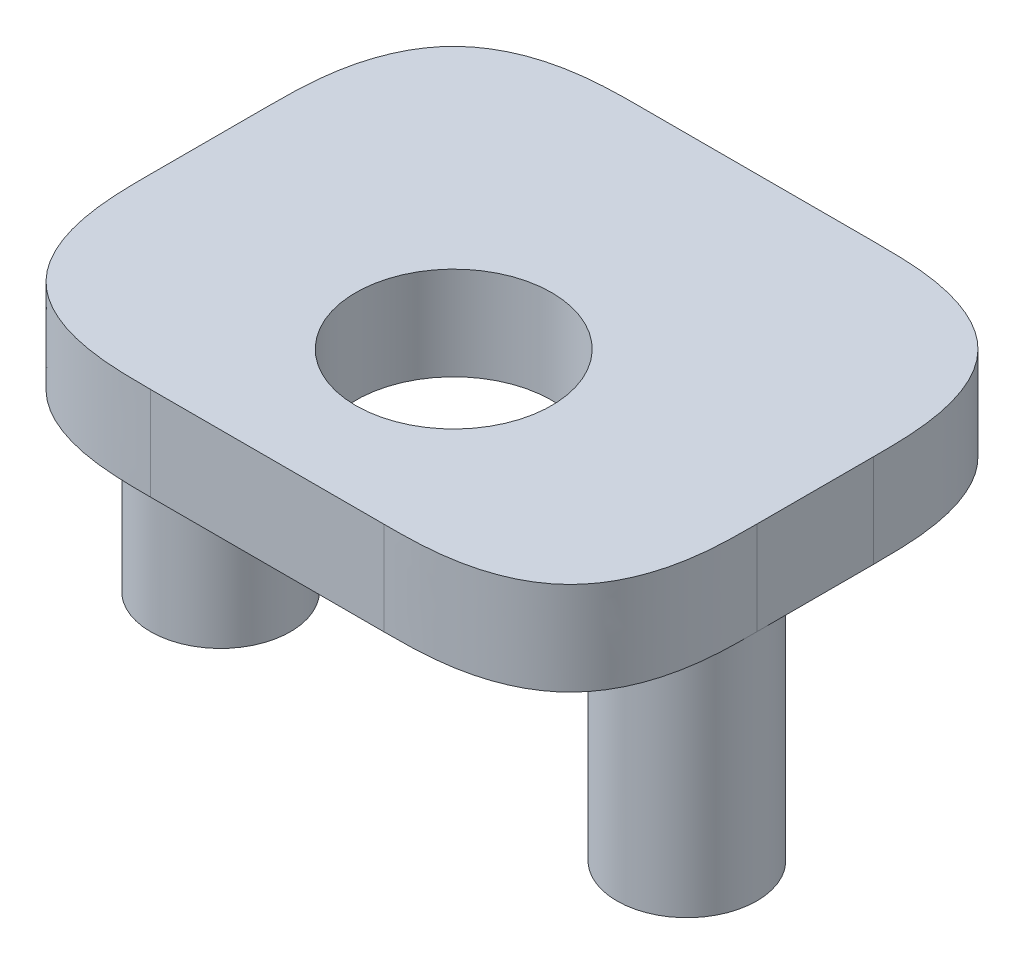
ISO-10303-21;
HEADER;
FILE_DESCRIPTION(('STEP AP214'),'2;1');
FILE_NAME('part.step','',(''),(''),'','','');
FILE_SCHEMA(('AUTOMOTIVE_DESIGN { 1 0 10303 214 1 1 1 1 }'));
ENDSEC;
DATA;
#1=APPLICATION_CONTEXT('core data for automotive mechanical design processes');
#2=APPLICATION_PROTOCOL_DEFINITION('international standard','automotive_design',2000,#1);
#3=PRODUCT_CONTEXT('',#1,'mechanical');
#4=PRODUCT('Part','Part','',(#3));
#5=PRODUCT_RELATED_PRODUCT_CATEGORY('part','',(#4));
#6=PRODUCT_DEFINITION_FORMATION('','',#4);
#7=PRODUCT_DEFINITION_CONTEXT('part definition',#1,'design');
#8=PRODUCT_DEFINITION('design','',#6,#7);
#9=PRODUCT_DEFINITION_SHAPE('','',#8);
#10=(LENGTH_UNIT() NAMED_UNIT(*) SI_UNIT(.MILLI.,.METRE.));
#11=(NAMED_UNIT(*) PLANE_ANGLE_UNIT() SI_UNIT($,.RADIAN.));
#12=(NAMED_UNIT(*) SI_UNIT($,.STERADIAN.) SOLID_ANGLE_UNIT());
#13=UNCERTAINTY_MEASURE_WITH_UNIT(LENGTH_MEASURE(1.E-05),#10,'distance_accuracy_value','');
#14=(GEOMETRIC_REPRESENTATION_CONTEXT(3) GLOBAL_UNCERTAINTY_ASSIGNED_CONTEXT((#13)) GLOBAL_UNIT_ASSIGNED_CONTEXT((#10,
#11,#12)) REPRESENTATION_CONTEXT('',''));
#15=CARTESIAN_POINT('',(0.,0.,0.));
#16=DIRECTION('',(0.,0.,1.));
#17=DIRECTION('',(1.,0.,0.));
#18=AXIS2_PLACEMENT_3D('',#15,#16,#17);
#19=CARTESIAN_POINT('',(0.,0.,0.));
#20=DIRECTION('',(0.,1.,0.));
#21=DIRECTION('',(0.,0.,1.));
#22=AXIS2_PLACEMENT_3D('',#19,#20,#21);
#23=PLANE('',#22);
#24=CARTESIAN_POINT('',(-5.,0.,0.));
#25=DIRECTION('',(0.,1.,0.));
#26=DIRECTION('',(0.,0.,1.));
#27=AXIS2_PLACEMENT_3D('',#24,#25,#26);
#28=CIRCLE('',#27,0.95);
#29=CARTESIAN_POINT('',(-5.,0.,0.949999999999965));
#30=VERTEX_POINT('',#29);
#31=EDGE_CURVE('E671',#30,#30,#28,.T.);
#32=ORIENTED_EDGE('',*,*,#31,.T.);
#33=EDGE_LOOP('',(#32));
#34=FACE_BOUND('',#33,.T.);
#35=CARTESIAN_POINT('',(-5.,0.,0.));
#36=DIRECTION('',(0.,1.,0.));
#37=DIRECTION('',(0.,0.,1.));
#38=AXIS2_PLACEMENT_3D('',#35,#36,#37);
#39=CIRCLE('',#38,1.5);
#40=CARTESIAN_POINT('',(-5.,0.,1.49999999999997));
#41=VERTEX_POINT('',#40);
#42=EDGE_CURVE('E183',#41,#41,#39,.T.);
#43=ORIENTED_EDGE('',*,*,#42,.F.);
#44=EDGE_LOOP('',(#43));
#45=FACE_BOUND('',#44,.T.);
#46=ADVANCED_FACE('F67',(#34,#45),#23,.F.);
#47=CARTESIAN_POINT('',(-5.,5.,0.));
#48=DIRECTION('',(0.,-1.,0.));
#49=DIRECTION('',(0.,0.,-1.));
#50=AXIS2_PLACEMENT_3D('',#47,#48,#49);
#51=CYLINDRICAL_SURFACE('',#50,1.5);
#52=CARTESIAN_POINT('',(-5.,5.,0.));
#53=DIRECTION('',(0.,1.,0.));
#54=DIRECTION('',(0.,0.,1.));
#55=AXIS2_PLACEMENT_3D('',#52,#53,#54);
#56=CIRCLE('',#55,1.5);
#57=CARTESIAN_POINT('',(-6.5,5.,0.));
#58=VERTEX_POINT('',#57);
#59=EDGE_CURVE('E152',#58,#58,#56,.T.);
#60=ORIENTED_EDGE('',*,*,#59,.F.);
#61=EDGE_LOOP('',(#60));
#62=FACE_BOUND('',#61,.T.);
#63=ORIENTED_EDGE('',*,*,#42,.T.);
#64=EDGE_LOOP('',(#63));
#65=FACE_BOUND('',#64,.T.);
#66=ADVANCED_FACE('F180',(#62,#65),#51,.T.);
#67=CARTESIAN_POINT('',(-6.5,7.,4.));
#68=DIRECTION('',(1.,0.,0.));
#69=DIRECTION('',(0.,0.,-1.));
#70=AXIS2_PLACEMENT_3D('',#67,#68,#69);
#71=PLANE('',#70);
#72=DIRECTION('',(0.,0.,1.));
#73=VECTOR('',#72,1.);
#74=CARTESIAN_POINT('',(-6.5,5.,4.));
#75=LINE('',#74,#73);
#76=CARTESIAN_POINT('',(-6.5,5.,-2.5));
#77=VERTEX_POINT('',#76);
#78=EDGE_CURVE('E167',#77,#58,#75,.T.);
#79=ORIENTED_EDGE('',*,*,#78,.T.);
#80=CARTESIAN_POINT('',(-6.5,7.1,0.));
#81=CARTESIAN_POINT('',(-6.5,6.36666666666657,0.));
#82=CARTESIAN_POINT('',(-6.5,5.63333333333333,0.));
#83=CARTESIAN_POINT('',(-6.5,4.9,0.));
#84=B_SPLINE_CURVE_WITH_KNOTS('',3,(#80,#81,#82,#83),.UNSPECIFIED.,.F.,.F.,(4,4),(-0.0001,
0.0021),.UNSPECIFIED.);
#85=CARTESIAN_POINT('',(-6.5,7.,0.));
#86=VERTEX_POINT('',#85);
#87=EDGE_CURVE('E170',#58,#86,#84,.F.);
#88=ORIENTED_EDGE('',*,*,#87,.T.);
#89=DIRECTION('',(0.,0.,1.));
#90=VECTOR('',#89,1.);
#91=CARTESIAN_POINT('',(-6.5,7.,4.));
#92=LINE('',#91,#90);
#93=CARTESIAN_POINT('',(-6.5,7.,-2.5));
#94=VERTEX_POINT('',#93);
#95=EDGE_CURVE('E542',#94,#86,#92,.T.);
#96=ORIENTED_EDGE('',*,*,#95,.F.);
#97=CARTESIAN_POINT('',(-6.5,4.9,-2.5));
#98=CARTESIAN_POINT('',(-6.5,5.63333333333333,-2.5));
#99=CARTESIAN_POINT('',(-6.5,6.36666666666657,-2.5));
#100=CARTESIAN_POINT('',(-6.5,7.1,-2.5));
#101=B_SPLINE_CURVE_WITH_KNOTS('',3,(#97,#98,#99,#100),.UNSPECIFIED.,.F.,.F.,(4,4),
(-9.99999999999998E-05,0.0021),.UNSPECIFIED.);
#102=EDGE_CURVE('E174',#94,#77,#101,.F.);
#103=ORIENTED_EDGE('',*,*,#102,.T.);
#104=EDGE_LOOP('',(#79,#88,#96,#103));
#105=FACE_BOUND('',#104,.T.);
#106=ADVANCED_FACE('F168',(#105),#71,.F.);
#107=CARTESIAN_POINT('',(-6.5,7.,4.));
#108=DIRECTION('',(0.,0.,-1.));
#109=DIRECTION('',(-1.,0.,0.));
#110=AXIS2_PLACEMENT_3D('',#107,#108,#109);
#111=PLANE('',#110);
#112=DIRECTION('',(1.,0.,0.));
#113=VECTOR('',#112,1.);
#114=CARTESIAN_POINT('',(-6.5,5.,4.));
#115=LINE('',#114,#113);
#116=CARTESIAN_POINT('',(-2.5,5.,4.));
#117=VERTEX_POINT('',#116);
#118=CARTESIAN_POINT('',(2.5,5.,4.));
#119=VERTEX_POINT('',#118);
#120=EDGE_CURVE('E155',#117,#119,#115,.T.);
#121=ORIENTED_EDGE('',*,*,#120,.T.);
#122=CARTESIAN_POINT('',(2.5,7.1,4.));
#123=CARTESIAN_POINT('',(2.5,6.36666666666657,4.));
#124=CARTESIAN_POINT('',(2.5,5.63333333333333,4.));
#125=CARTESIAN_POINT('',(2.5,4.9,4.));
#126=B_SPLINE_CURVE_WITH_KNOTS('',3,(#122,#123,#124,#125),.UNSPECIFIED.,.F.,.F.,(4,4),(-0.0001,
0.0021),.UNSPECIFIED.);
#127=CARTESIAN_POINT('',(2.5,7.,4.));
#128=VERTEX_POINT('',#127);
#129=EDGE_CURVE('E373',#119,#128,#126,.F.);
#130=ORIENTED_EDGE('',*,*,#129,.T.);
#131=DIRECTION('',(1.,0.,0.));
#132=VECTOR('',#131,1.);
#133=CARTESIAN_POINT('',(-6.5,7.,4.));
#134=LINE('',#133,#132);
#135=CARTESIAN_POINT('',(-2.5,7.,4.));
#136=VERTEX_POINT('',#135);
#137=EDGE_CURVE('E203',#136,#128,#134,.T.);
#138=ORIENTED_EDGE('',*,*,#137,.F.);
#139=CARTESIAN_POINT('',(-2.5,4.9,4.));
#140=CARTESIAN_POINT('',(-2.5,5.63333333333333,4.));
#141=CARTESIAN_POINT('',(-2.5,6.36666666666657,4.));
#142=CARTESIAN_POINT('',(-2.5,7.1,4.));
#143=B_SPLINE_CURVE_WITH_KNOTS('',3,(#139,#140,#141,#142),.UNSPECIFIED.,.F.,.F.,(4,4),
(-9.99999999999998E-05,0.0021),.UNSPECIFIED.);
#144=EDGE_CURVE('E392',#136,#117,#143,.F.);
#145=ORIENTED_EDGE('',*,*,#144,.T.);
#146=EDGE_LOOP('',(#121,#130,#138,#145));
#147=FACE_BOUND('',#146,.T.);
#148=ADVANCED_FACE('F485',(#147),#111,.F.);
#149=CARTESIAN_POINT('',(6.5,7.,4.));
#150=DIRECTION('',(-1.,0.,0.));
#151=DIRECTION('',(0.,0.,1.));
#152=AXIS2_PLACEMENT_3D('',#149,#150,#151);
#153=PLANE('',#152);
#154=DIRECTION('',(0.,0.,-1.));
#155=VECTOR('',#154,1.);
#156=CARTESIAN_POINT('',(6.5,7.,4.));
#157=LINE('',#156,#155);
#158=CARTESIAN_POINT('',(6.5,7.,0.));
#159=VERTEX_POINT('',#158);
#160=CARTESIAN_POINT('',(6.5,7.,-2.5));
#161=VERTEX_POINT('',#160);
#162=EDGE_CURVE('E191',#159,#161,#157,.T.);
#163=ORIENTED_EDGE('',*,*,#162,.F.);
#164=CARTESIAN_POINT('',(6.5,4.9,0.));
#165=CARTESIAN_POINT('',(6.5,5.63333333333333,0.));
#166=CARTESIAN_POINT('',(6.5,6.36666666666657,0.));
#167=CARTESIAN_POINT('',(6.5,7.1,0.));
#168=B_SPLINE_CURVE_WITH_KNOTS('',3,(#164,#165,#166,#167),.UNSPECIFIED.,.F.,.F.,(4,4),
(-9.99999999999998E-05,0.0021),.UNSPECIFIED.);
#169=CARTESIAN_POINT('',(6.5,5.,0.));
#170=VERTEX_POINT('',#169);
#171=EDGE_CURVE('E257',#159,#170,#168,.F.);
#172=ORIENTED_EDGE('',*,*,#171,.T.);
#173=DIRECTION('',(0.,0.,-1.));
#174=VECTOR('',#173,1.);
#175=CARTESIAN_POINT('',(6.5,5.,4.));
#176=LINE('',#175,#174);
#177=CARTESIAN_POINT('',(6.5,5.,-2.5));
#178=VERTEX_POINT('',#177);
#179=EDGE_CURVE('E242',#170,#178,#176,.T.);
#180=ORIENTED_EDGE('',*,*,#179,.T.);
#181=CARTESIAN_POINT('',(6.5,7.1,-2.5));
#182=CARTESIAN_POINT('',(6.5,6.36666666666657,-2.5));
#183=CARTESIAN_POINT('',(6.5,5.63333333333333,-2.5));
#184=CARTESIAN_POINT('',(6.5,4.9,-2.5));
#185=B_SPLINE_CURVE_WITH_KNOTS('',3,(#181,#182,#183,#184),.UNSPECIFIED.,.F.,.F.,(4,4),(-0.0001,
0.0021),.UNSPECIFIED.);
#186=EDGE_CURVE('E189',#178,#161,#185,.F.);
#187=ORIENTED_EDGE('',*,*,#186,.T.);
#188=EDGE_LOOP('',(#163,#172,#180,#187));
#189=FACE_BOUND('',#188,.T.);
#190=ADVANCED_FACE('F254',(#189),#153,.F.);
#191=CARTESIAN_POINT('',(-6.5,7.,-6.5));
#192=DIRECTION('',(0.,0.,1.));
#193=DIRECTION('',(1.,0.,0.));
#194=AXIS2_PLACEMENT_3D('',#191,#192,#193);
#195=PLANE('',#194);
#196=DIRECTION('',(-1.,0.,0.));
#197=VECTOR('',#196,1.);
#198=CARTESIAN_POINT('',(-6.5,7.,-6.5));
#199=LINE('',#198,#197);
#200=CARTESIAN_POINT('',(2.5,7.,-6.5));
#201=VERTEX_POINT('',#200);
#202=CARTESIAN_POINT('',(-2.5,7.,-6.5));
#203=VERTEX_POINT('',#202);
#204=EDGE_CURVE('E184',#201,#203,#199,.T.);
#205=ORIENTED_EDGE('',*,*,#204,.F.);
#206=CARTESIAN_POINT('',(2.5,4.9,-6.5));
#207=CARTESIAN_POINT('',(2.5,5.63333333333333,-6.5));
#208=CARTESIAN_POINT('',(2.5,6.36666666666657,-6.5));
#209=CARTESIAN_POINT('',(2.5,7.1,-6.5));
#210=B_SPLINE_CURVE_WITH_KNOTS('',3,(#206,#207,#208,#209),.UNSPECIFIED.,.F.,.F.,(4,4),
(-9.99999999999998E-05,0.0021),.UNSPECIFIED.);
#211=CARTESIAN_POINT('',(2.5,5.,-6.5));
#212=VERTEX_POINT('',#211);
#213=EDGE_CURVE('E12',#201,#212,#210,.F.);
#214=ORIENTED_EDGE('',*,*,#213,.T.);
#215=DIRECTION('',(-1.,0.,0.));
#216=VECTOR('',#215,1.);
#217=CARTESIAN_POINT('',(-6.5,5.,-6.5));
#218=LINE('',#217,#216);
#219=CARTESIAN_POINT('',(0.,5.,-6.5));
#220=VERTEX_POINT('',#219);
#221=EDGE_CURVE('E244',#212,#220,#218,.T.);
#222=ORIENTED_EDGE('',*,*,#221,.T.);
#223=CARTESIAN_POINT('',(-2.5,5.,-6.5));
#224=VERTEX_POINT('',#223);
#225=EDGE_CURVE('E261',#220,#224,#218,.T.);
#226=ORIENTED_EDGE('',*,*,#225,.T.);
#227=CARTESIAN_POINT('',(-2.5,7.1,-6.5));
#228=CARTESIAN_POINT('',(-2.5,6.36666666666657,-6.5));
#229=CARTESIAN_POINT('',(-2.5,5.63333333333333,-6.5));
#230=CARTESIAN_POINT('',(-2.5,4.9,-6.5));
#231=B_SPLINE_CURVE_WITH_KNOTS('',3,(#227,#228,#229,#230),.UNSPECIFIED.,.F.,.F.,(4,4),(-0.0001,
0.0021),.UNSPECIFIED.);
#232=EDGE_CURVE('E82',#224,#203,#231,.F.);
#233=ORIENTED_EDGE('',*,*,#232,.T.);
#234=EDGE_LOOP('',(#205,#214,#222,#226,#233));
#235=FACE_BOUND('',#234,.T.);
#236=ADVANCED_FACE('F221',(#235),#195,.F.);
#237=CARTESIAN_POINT('',(0.,7.,0.));
#238=DIRECTION('',(0.,-1.,0.));
#239=DIRECTION('',(0.,0.,-1.));
#240=AXIS2_PLACEMENT_3D('',#237,#238,#239);
#241=PLANE('',#240);
#242=CARTESIAN_POINT('',(0.,7.,0.));
#243=DIRECTION('',(0.,-1.,0.));
#244=DIRECTION('',(0.,0.,-1.));
#245=AXIS2_PLACEMENT_3D('',#242,#243,#244);
#246=CIRCLE('',#245,2.1);
#247=CARTESIAN_POINT('',(0.,7.,-2.1));
#248=VERTEX_POINT('',#247);
#249=EDGE_CURVE('E564',#248,#248,#246,.T.);
#250=ORIENTED_EDGE('',*,*,#249,.T.);
#251=EDGE_LOOP('',(#250));
#252=FACE_BOUND('',#251,.T.);
#253=ORIENTED_EDGE('',*,*,#137,.T.);
#254=CARTESIAN_POINT('',(6.5,7.,0.));
#255=CARTESIAN_POINT('',(6.5,7.,0.672792206135785));
#256=CARTESIAN_POINT('',(6.5,7.,1.34558441227157));
#257=CARTESIAN_POINT('',(6.21323232065567,7.,2.82842712474619));
#258=CARTESIAN_POINT('',(5.32842712474619,7.,3.71323232065567));
#259=CARTESIAN_POINT('',(3.84558441227157,7.,4.));
#260=CARTESIAN_POINT('',(3.17279220613579,7.,4.));
#261=CARTESIAN_POINT('',(2.5,7.,4.));
#262=B_SPLINE_CURVE_WITH_KNOTS('',5,(#254,#255,#256,#257,#258,#259,#260,#261),.UNSPECIFIED.,.F.,
.F.,(6,2,6),(0.,0.5,1.),.UNSPECIFIED.);
#263=EDGE_CURVE('E422',#128,#159,#262,.F.);
#264=ORIENTED_EDGE('',*,*,#263,.T.);
#265=ORIENTED_EDGE('',*,*,#162,.T.);
#266=CARTESIAN_POINT('',(2.5,7.,-6.5));
#267=CARTESIAN_POINT('',(3.17279220613579,7.,-6.5));
#268=CARTESIAN_POINT('',(3.84558441227157,7.,-6.5));
#269=CARTESIAN_POINT('',(5.32842712474619,7.,-6.21323232065567));
#270=CARTESIAN_POINT('',(6.21323232065567,7.,-5.32842712474619));
#271=CARTESIAN_POINT('',(6.5,7.,-3.84558441227157));
#272=CARTESIAN_POINT('',(6.5,7.,-3.17279220613579));
#273=CARTESIAN_POINT('',(6.5,7.,-2.5));
#274=B_SPLINE_CURVE_WITH_KNOTS('',5,(#266,#267,#268,#269,#270,#271,#272,#273),.UNSPECIFIED.,.F.,
.F.,(6,2,6),(0.,0.5,1.),.UNSPECIFIED.);
#275=EDGE_CURVE('E96',#161,#201,#274,.F.);
#276=ORIENTED_EDGE('',*,*,#275,.T.);
#277=ORIENTED_EDGE('',*,*,#204,.T.);
#278=CARTESIAN_POINT('',(-6.5,7.,-2.5));
#279=CARTESIAN_POINT('',(-6.5,7.,-3.17279220613579));
#280=CARTESIAN_POINT('',(-6.5,7.,-3.84558441227157));
#281=CARTESIAN_POINT('',(-6.21323232065567,7.,-5.32842712474619));
#282=CARTESIAN_POINT('',(-5.32842712474619,7.,-6.21323232065567));
#283=CARTESIAN_POINT('',(-3.84558441227157,7.,-6.5));
#284=CARTESIAN_POINT('',(-3.17279220613579,7.,-6.5));
#285=CARTESIAN_POINT('',(-2.5,7.,-6.5));
#286=B_SPLINE_CURVE_WITH_KNOTS('',5,(#278,#279,#280,#281,#282,#283,#284,#285),.UNSPECIFIED.,.F.,
.F.,(6,2,6),(0.,0.5,1.),.UNSPECIFIED.);
#287=EDGE_CURVE('E430',#203,#94,#286,.F.);
#288=ORIENTED_EDGE('',*,*,#287,.T.);
#289=ORIENTED_EDGE('',*,*,#95,.T.);
#290=CARTESIAN_POINT('',(-2.5,7.,4.));
#291=CARTESIAN_POINT('',(-3.17279220613579,7.,4.));
#292=CARTESIAN_POINT('',(-3.84558441227157,7.,4.));
#293=CARTESIAN_POINT('',(-5.32842712474619,7.,3.71323232065567));
#294=CARTESIAN_POINT('',(-6.21323232065567,7.,2.82842712474619));
#295=CARTESIAN_POINT('',(-6.5,7.,1.34558441227157));
#296=CARTESIAN_POINT('',(-6.5,7.,0.672792206135785));
#297=CARTESIAN_POINT('',(-6.5,7.,0.));
#298=B_SPLINE_CURVE_WITH_KNOTS('',5,(#290,#291,#292,#293,#294,#295,#296,#297),.UNSPECIFIED.,.F.,
.F.,(6,2,6),(0.,0.5,1.),.UNSPECIFIED.);
#299=EDGE_CURVE('E402',#86,#136,#298,.F.);
#300=ORIENTED_EDGE('',*,*,#299,.T.);
#301=EDGE_LOOP('',(#253,#264,#265,#276,#277,#288,#289,#300));
#302=FACE_BOUND('',#301,.T.);
#303=ADVANCED_FACE('F216',(#252,#302),#241,.F.);
#304=CARTESIAN_POINT('',(0.,5.,0.));
#305=DIRECTION('',(0.,-1.,0.));
#306=DIRECTION('',(0.,0.,-1.));
#307=AXIS2_PLACEMENT_3D('',#304,#305,#306);
#308=PLANE('',#307);
#309=CARTESIAN_POINT('',(0.,5.,0.));
#310=DIRECTION('',(0.,-1.,0.));
#311=DIRECTION('',(0.,0.,-1.));
#312=AXIS2_PLACEMENT_3D('',#309,#310,#311);
#313=CIRCLE('',#312,2.1);
#314=CARTESIAN_POINT('',(0.,5.,-2.1));
#315=VERTEX_POINT('',#314);
#316=EDGE_CURVE('E560',#315,#315,#313,.F.);
#317=ORIENTED_EDGE('',*,*,#316,.T.);
#318=EDGE_LOOP('',(#317));
#319=FACE_BOUND('',#318,.T.);
#320=CARTESIAN_POINT('',(5.,5.,0.));
#321=DIRECTION('',(0.,1.,0.));
#322=DIRECTION('',(0.,0.,1.));
#323=AXIS2_PLACEMENT_3D('',#320,#321,#322);
#324=CIRCLE('',#323,1.5);
#325=EDGE_CURVE('E563',#170,#170,#324,.T.);
#326=ORIENTED_EDGE('',*,*,#325,.T.);
#327=CARTESIAN_POINT('',(2.5,5.,4.));
#328=CARTESIAN_POINT('',(3.17279220613579,5.,4.));
#329=CARTESIAN_POINT('',(3.84558441227157,5.,4.));
#330=CARTESIAN_POINT('',(5.32842712474619,5.,3.71323232065567));
#331=CARTESIAN_POINT('',(6.21323232065567,5.,2.82842712474619));
#332=CARTESIAN_POINT('',(6.5,5.,1.34558441227157));
#333=CARTESIAN_POINT('',(6.5,5.,0.672792206135785));
#334=CARTESIAN_POINT('',(6.5,5.,0.));
#335=B_SPLINE_CURVE_WITH_KNOTS('',5,(#327,#328,#329,#330,#331,#332,#333,#334),.UNSPECIFIED.,.F.,
.F.,(6,2,6),(0.,0.5,1.),.UNSPECIFIED.);
#336=EDGE_CURVE('E161',#170,#119,#335,.F.);
#337=ORIENTED_EDGE('',*,*,#336,.T.);
#338=ORIENTED_EDGE('',*,*,#120,.F.);
#339=CARTESIAN_POINT('',(-6.5,5.,0.));
#340=CARTESIAN_POINT('',(-6.5,5.,0.672792206135785));
#341=CARTESIAN_POINT('',(-6.5,5.,1.34558441227157));
#342=CARTESIAN_POINT('',(-6.21323232065567,5.,2.82842712474619));
#343=CARTESIAN_POINT('',(-5.32842712474619,5.,3.71323232065567));
#344=CARTESIAN_POINT('',(-3.84558441227157,5.,4.));
#345=CARTESIAN_POINT('',(-3.17279220613579,5.,4.));
#346=CARTESIAN_POINT('',(-2.5,5.,4.));
#347=B_SPLINE_CURVE_WITH_KNOTS('',5,(#339,#340,#341,#342,#343,#344,#345,#346),.UNSPECIFIED.,.F.,
.F.,(6,2,6),(0.,0.5,1.),.UNSPECIFIED.);
#348=EDGE_CURVE('E145',#117,#58,#347,.F.);
#349=ORIENTED_EDGE('',*,*,#348,.T.);
#350=ORIENTED_EDGE('',*,*,#59,.T.);
#351=ORIENTED_EDGE('',*,*,#78,.F.);
#352=CARTESIAN_POINT('',(-2.5,5.,-6.5));
#353=CARTESIAN_POINT('',(-3.17279220613579,5.,-6.5));
#354=CARTESIAN_POINT('',(-3.84558441227157,5.,-6.5));
#355=CARTESIAN_POINT('',(-5.32842712474619,5.,-6.21323232065567));
#356=CARTESIAN_POINT('',(-6.21323232065567,5.,-5.32842712474619));
#357=CARTESIAN_POINT('',(-6.5,5.,-3.84558441227157));
#358=CARTESIAN_POINT('',(-6.5,5.,-3.17279220613579));
#359=CARTESIAN_POINT('',(-6.5,5.,-2.5));
#360=B_SPLINE_CURVE_WITH_KNOTS('',5,(#352,#353,#354,#355,#356,#357,#358,#359),.UNSPECIFIED.,.F.,
.F.,(6,2,6),(0.,0.5,1.),.UNSPECIFIED.);
#361=EDGE_CURVE('E250',#77,#224,#360,.F.);
#362=ORIENTED_EDGE('',*,*,#361,.T.);
#363=ORIENTED_EDGE('',*,*,#225,.F.);
#364=CARTESIAN_POINT('',(0.,5.,-5.));
#365=DIRECTION('',(0.,1.,0.));
#366=DIRECTION('',(0.,0.,1.));
#367=AXIS2_PLACEMENT_3D('',#364,#365,#366);
#368=CIRCLE('',#367,1.5);
#369=EDGE_CURVE('E177',#220,#220,#368,.T.);
#370=ORIENTED_EDGE('',*,*,#369,.T.);
#371=ORIENTED_EDGE('',*,*,#221,.F.);
#372=CARTESIAN_POINT('',(6.5,5.,-2.5));
#373=CARTESIAN_POINT('',(6.5,5.,-3.17279220613579));
#374=CARTESIAN_POINT('',(6.5,5.,-3.84558441227157));
#375=CARTESIAN_POINT('',(6.21323232065567,5.,-5.32842712474619));
#376=CARTESIAN_POINT('',(5.32842712474619,5.,-6.21323232065567));
#377=CARTESIAN_POINT('',(3.84558441227157,5.,-6.5));
#378=CARTESIAN_POINT('',(3.17279220613579,5.,-6.5));
#379=CARTESIAN_POINT('',(2.5,5.,-6.5));
#380=B_SPLINE_CURVE_WITH_KNOTS('',5,(#372,#373,#374,#375,#376,#377,#378,#379),.UNSPECIFIED.,.F.,
.F.,(6,2,6),(0.,0.5,1.),.UNSPECIFIED.);
#381=EDGE_CURVE('E162',#212,#178,#380,.F.);
#382=ORIENTED_EDGE('',*,*,#381,.T.);
#383=ORIENTED_EDGE('',*,*,#179,.F.);
#384=EDGE_LOOP('',(#326,#337,#338,#349,#350,#351,#362,#363,#370,#371,#382,#383));
#385=FACE_BOUND('',#384,.T.);
#386=ADVANCED_FACE('F149',(#319,#385),#308,.T.);
#387=CARTESIAN_POINT('',(0.,0.,0.));
#388=DIRECTION('',(0.,1.,0.));
#389=DIRECTION('',(0.,0.,1.));
#390=AXIS2_PLACEMENT_3D('',#387,#388,#389);
#391=PLANE('',#390);
#392=CARTESIAN_POINT('',(0.,0.,-5.));
#393=DIRECTION('',(0.,1.,0.));
#394=DIRECTION('',(0.,0.,1.));
#395=AXIS2_PLACEMENT_3D('',#392,#393,#394);
#396=CIRCLE('',#395,0.95);
#397=CARTESIAN_POINT('',(0.,0.,-4.05));
#398=VERTEX_POINT('',#397);
#399=EDGE_CURVE('E665',#398,#398,#396,.T.);
#400=ORIENTED_EDGE('',*,*,#399,.T.);
#401=EDGE_LOOP('',(#400));
#402=FACE_BOUND('',#401,.T.);
#403=CARTESIAN_POINT('',(0.,0.,-5.));
#404=DIRECTION('',(0.,1.,0.));
#405=DIRECTION('',(0.,0.,1.));
#406=AXIS2_PLACEMENT_3D('',#403,#404,#405);
#407=CIRCLE('',#406,1.5);
#408=CARTESIAN_POINT('',(0.,0.,-3.5));
#409=VERTEX_POINT('',#408);
#410=EDGE_CURVE('E592',#409,#409,#407,.T.);
#411=ORIENTED_EDGE('',*,*,#410,.F.);
#412=EDGE_LOOP('',(#411));
#413=FACE_BOUND('',#412,.T.);
#414=ADVANCED_FACE('F215',(#402,#413),#391,.F.);
#415=CARTESIAN_POINT('',(0.,5.,-5.));
#416=DIRECTION('',(0.,-1.,0.));
#417=DIRECTION('',(0.,0.,-1.));
#418=AXIS2_PLACEMENT_3D('',#415,#416,#417);
#419=CYLINDRICAL_SURFACE('',#418,1.5);
#420=ORIENTED_EDGE('',*,*,#369,.F.);
#421=EDGE_LOOP('',(#420));
#422=FACE_BOUND('',#421,.T.);
#423=ORIENTED_EDGE('',*,*,#410,.T.);
#424=EDGE_LOOP('',(#423));
#425=FACE_BOUND('',#424,.T.);
#426=ADVANCED_FACE('F218',(#422,#425),#419,.T.);
#427=CARTESIAN_POINT('',(0.,0.,0.));
#428=DIRECTION('',(0.,1.,0.));
#429=DIRECTION('',(0.,0.,1.));
#430=AXIS2_PLACEMENT_3D('',#427,#428,#429);
#431=PLANE('',#430);
#432=CARTESIAN_POINT('',(5.,0.,0.));
#433=DIRECTION('',(0.,1.,0.));
#434=DIRECTION('',(0.,0.,1.));
#435=AXIS2_PLACEMENT_3D('',#432,#433,#434);
#436=CIRCLE('',#435,0.95);
#437=CARTESIAN_POINT('',(5.,0.,0.95));
#438=VERTEX_POINT('',#437);
#439=EDGE_CURVE('E653',#438,#438,#436,.T.);
#440=ORIENTED_EDGE('',*,*,#439,.T.);
#441=EDGE_LOOP('',(#440));
#442=FACE_BOUND('',#441,.T.);
#443=CARTESIAN_POINT('',(5.,0.,0.));
#444=DIRECTION('',(0.,1.,0.));
#445=DIRECTION('',(0.,0.,1.));
#446=AXIS2_PLACEMENT_3D('',#443,#444,#445);
#447=CIRCLE('',#446,1.5);
#448=CARTESIAN_POINT('',(5.,0.,1.5));
#449=VERTEX_POINT('',#448);
#450=EDGE_CURVE('E588',#449,#449,#447,.T.);
#451=ORIENTED_EDGE('',*,*,#450,.F.);
#452=EDGE_LOOP('',(#451));
#453=FACE_BOUND('',#452,.T.);
#454=ADVANCED_FACE('F608',(#442,#453),#431,.F.);
#455=CARTESIAN_POINT('',(5.,5.,0.));
#456=DIRECTION('',(0.,-1.,0.));
#457=DIRECTION('',(0.,0.,-1.));
#458=AXIS2_PLACEMENT_3D('',#455,#456,#457);
#459=CYLINDRICAL_SURFACE('',#458,1.5);
#460=ORIENTED_EDGE('',*,*,#325,.F.);
#461=EDGE_LOOP('',(#460));
#462=FACE_BOUND('',#461,.T.);
#463=ORIENTED_EDGE('',*,*,#450,.T.);
#464=EDGE_LOOP('',(#463));
#465=FACE_BOUND('',#464,.T.);
#466=ADVANCED_FACE('F614',(#462,#465),#459,.T.);
#467=CARTESIAN_POINT('',(0.,12.939696961967,0.));
#468=DIRECTION('',(0.,-1.,0.));
#469=DIRECTION('',(0.,0.,-1.));
#470=AXIS2_PLACEMENT_3D('',#467,#468,#469);
#471=CYLINDRICAL_SURFACE('',#470,2.1);
#472=ORIENTED_EDGE('',*,*,#316,.F.);
#473=EDGE_LOOP('',(#472));
#474=FACE_BOUND('',#473,.T.);
#475=ORIENTED_EDGE('',*,*,#249,.F.);
#476=EDGE_LOOP('',(#475));
#477=FACE_BOUND('',#476,.T.);
#478=ADVANCED_FACE('F349',(#474,#477),#471,.F.);
#479=CARTESIAN_POINT('',(6.5,7.1,0.));
#480=CARTESIAN_POINT('',(6.5,6.36666666666657,0.));
#481=CARTESIAN_POINT('',(6.5,5.63333333333333,0.));
#482=CARTESIAN_POINT('',(6.5,4.9,0.));
#483=CARTESIAN_POINT('',(6.5,7.1,0.672792206135785));
#484=CARTESIAN_POINT('',(6.5,6.36666666666657,0.672792206135785));
#485=CARTESIAN_POINT('',(6.5,5.63333333333333,0.672792206135785));
#486=CARTESIAN_POINT('',(6.5,4.9,0.672792206135785));
#487=CARTESIAN_POINT('',(6.5,7.1,1.34558441227157));
#488=CARTESIAN_POINT('',(6.5,6.36666666666657,1.34558441227157));
#489=CARTESIAN_POINT('',(6.5,5.63333333333333,1.34558441227157));
#490=CARTESIAN_POINT('',(6.5,4.9,1.34558441227157));
#491=CARTESIAN_POINT('',(6.21323232065567,7.1,2.82842712474619));
#492=CARTESIAN_POINT('',(6.21323232065567,6.36666666666657,2.82842712474619));
#493=CARTESIAN_POINT('',(6.21323232065567,5.63333333333333,2.82842712474619));
#494=CARTESIAN_POINT('',(6.21323232065567,4.9,2.82842712474619));
#495=CARTESIAN_POINT('',(5.32842712474619,7.1,3.71323232065567));
#496=CARTESIAN_POINT('',(5.32842712474619,6.36666666666657,3.71323232065567));
#497=CARTESIAN_POINT('',(5.32842712474619,5.63333333333333,3.71323232065567));
#498=CARTESIAN_POINT('',(5.32842712474619,4.9,3.71323232065567));
#499=CARTESIAN_POINT('',(3.84558441227157,7.1,4.));
#500=CARTESIAN_POINT('',(3.84558441227157,6.36666666666657,4.));
#501=CARTESIAN_POINT('',(3.84558441227157,5.63333333333333,4.));
#502=CARTESIAN_POINT('',(3.84558441227157,4.9,4.));
#503=CARTESIAN_POINT('',(3.17279220613579,7.1,4.));
#504=CARTESIAN_POINT('',(3.17279220613579,6.36666666666657,4.));
#505=CARTESIAN_POINT('',(3.17279220613579,5.63333333333333,4.));
#506=CARTESIAN_POINT('',(3.17279220613579,4.9,4.));
#507=CARTESIAN_POINT('',(2.5,7.1,4.));
#508=CARTESIAN_POINT('',(2.5,6.36666666666657,4.));
#509=CARTESIAN_POINT('',(2.5,5.63333333333333,4.));
#510=CARTESIAN_POINT('',(2.5,4.9,4.));
#511=B_SPLINE_SURFACE_WITH_KNOTS('',5,3,((#479,#480,#481,#482),(#483,#484,#485,#486),(#487,#488,
#489,#490),(#491,#492,#493,#494),(#495,#496,#497,#498),(#499,#500,#501,#502),(#503,#504,#505,
#506),(#507,#508,#509,#510)),.UNSPECIFIED.,.F.,.F.,.F.,(6,2,6),(4,4),(0.,0.5,1.),(-0.0001,
0.0021),.UNSPECIFIED.);
#512=ORIENTED_EDGE('',*,*,#263,.F.);
#513=ORIENTED_EDGE('',*,*,#129,.F.);
#514=ORIENTED_EDGE('',*,*,#336,.F.);
#515=ORIENTED_EDGE('',*,*,#171,.F.);
#516=EDGE_LOOP('',(#512,#513,#514,#515));
#517=FACE_BOUND('',#516,.T.);
#518=ADVANCED_FACE('F336',(#517),#511,.T.);
#519=CARTESIAN_POINT('',(-2.5,7.1,4.));
#520=CARTESIAN_POINT('',(-2.5,6.36666666666657,4.));
#521=CARTESIAN_POINT('',(-2.5,5.63333333333333,4.));
#522=CARTESIAN_POINT('',(-2.5,4.9,4.));
#523=CARTESIAN_POINT('',(-3.17279220613579,7.1,4.));
#524=CARTESIAN_POINT('',(-3.17279220613579,6.36666666666657,4.));
#525=CARTESIAN_POINT('',(-3.17279220613579,5.63333333333333,4.));
#526=CARTESIAN_POINT('',(-3.17279220613579,4.9,4.));
#527=CARTESIAN_POINT('',(-3.84558441227157,7.1,4.));
#528=CARTESIAN_POINT('',(-3.84558441227157,6.36666666666657,4.));
#529=CARTESIAN_POINT('',(-3.84558441227157,5.63333333333333,4.));
#530=CARTESIAN_POINT('',(-3.84558441227157,4.9,4.));
#531=CARTESIAN_POINT('',(-5.32842712474619,7.1,3.71323232065567));
#532=CARTESIAN_POINT('',(-5.32842712474619,6.36666666666657,3.71323232065567));
#533=CARTESIAN_POINT('',(-5.32842712474619,5.63333333333333,3.71323232065567));
#534=CARTESIAN_POINT('',(-5.32842712474619,4.9,3.71323232065567));
#535=CARTESIAN_POINT('',(-6.21323232065567,7.1,2.82842712474619));
#536=CARTESIAN_POINT('',(-6.21323232065567,6.36666666666657,2.82842712474619));
#537=CARTESIAN_POINT('',(-6.21323232065567,5.63333333333333,2.82842712474619));
#538=CARTESIAN_POINT('',(-6.21323232065567,4.9,2.82842712474619));
#539=CARTESIAN_POINT('',(-6.5,7.1,1.34558441227157));
#540=CARTESIAN_POINT('',(-6.5,6.36666666666657,1.34558441227157));
#541=CARTESIAN_POINT('',(-6.5,5.63333333333333,1.34558441227157));
#542=CARTESIAN_POINT('',(-6.5,4.9,1.34558441227157));
#543=CARTESIAN_POINT('',(-6.5,7.1,0.672792206135785));
#544=CARTESIAN_POINT('',(-6.5,6.36666666666657,0.672792206135785));
#545=CARTESIAN_POINT('',(-6.5,5.63333333333333,0.672792206135785));
#546=CARTESIAN_POINT('',(-6.5,4.9,0.672792206135785));
#547=CARTESIAN_POINT('',(-6.5,7.1,0.));
#548=CARTESIAN_POINT('',(-6.5,6.36666666666657,0.));
#549=CARTESIAN_POINT('',(-6.5,5.63333333333333,0.));
#550=CARTESIAN_POINT('',(-6.5,4.9,0.));
#551=B_SPLINE_SURFACE_WITH_KNOTS('',5,3,((#519,#520,#521,#522),(#523,#524,#525,#526),(#527,#528,
#529,#530),(#531,#532,#533,#534),(#535,#536,#537,#538),(#539,#540,#541,#542),(#543,#544,#545,
#546),(#547,#548,#549,#550)),.UNSPECIFIED.,.F.,.F.,.F.,(6,2,6),(4,4),(0.,0.5,1.),(-0.0001,
0.0021),.UNSPECIFIED.);
#552=ORIENTED_EDGE('',*,*,#299,.F.);
#553=ORIENTED_EDGE('',*,*,#87,.F.);
#554=ORIENTED_EDGE('',*,*,#348,.F.);
#555=ORIENTED_EDGE('',*,*,#144,.F.);
#556=EDGE_LOOP('',(#552,#553,#554,#555));
#557=FACE_BOUND('',#556,.T.);
#558=ADVANCED_FACE('F289',(#557),#551,.T.);
#559=CARTESIAN_POINT('',(2.5,7.1,-6.5));
#560=CARTESIAN_POINT('',(2.5,6.36666666666657,-6.5));
#561=CARTESIAN_POINT('',(2.5,5.63333333333333,-6.5));
#562=CARTESIAN_POINT('',(2.5,4.9,-6.5));
#563=CARTESIAN_POINT('',(3.17279220613579,7.1,-6.5));
#564=CARTESIAN_POINT('',(3.17279220613579,6.36666666666657,-6.5));
#565=CARTESIAN_POINT('',(3.17279220613579,5.63333333333333,-6.5));
#566=CARTESIAN_POINT('',(3.17279220613579,4.9,-6.5));
#567=CARTESIAN_POINT('',(3.84558441227157,7.1,-6.5));
#568=CARTESIAN_POINT('',(3.84558441227157,6.36666666666657,-6.5));
#569=CARTESIAN_POINT('',(3.84558441227157,5.63333333333333,-6.5));
#570=CARTESIAN_POINT('',(3.84558441227157,4.9,-6.5));
#571=CARTESIAN_POINT('',(5.32842712474619,7.1,-6.21323232065567));
#572=CARTESIAN_POINT('',(5.32842712474619,6.36666666666657,-6.21323232065567));
#573=CARTESIAN_POINT('',(5.32842712474619,5.63333333333333,-6.21323232065567));
#574=CARTESIAN_POINT('',(5.32842712474619,4.9,-6.21323232065567));
#575=CARTESIAN_POINT('',(6.21323232065567,7.1,-5.32842712474619));
#576=CARTESIAN_POINT('',(6.21323232065567,6.36666666666657,-5.32842712474619));
#577=CARTESIAN_POINT('',(6.21323232065567,5.63333333333333,-5.32842712474619));
#578=CARTESIAN_POINT('',(6.21323232065567,4.9,-5.32842712474619));
#579=CARTESIAN_POINT('',(6.5,7.1,-3.84558441227157));
#580=CARTESIAN_POINT('',(6.5,6.36666666666657,-3.84558441227157));
#581=CARTESIAN_POINT('',(6.5,5.63333333333333,-3.84558441227157));
#582=CARTESIAN_POINT('',(6.5,4.9,-3.84558441227157));
#583=CARTESIAN_POINT('',(6.5,7.1,-3.17279220613579));
#584=CARTESIAN_POINT('',(6.5,6.36666666666657,-3.17279220613578));
#585=CARTESIAN_POINT('',(6.5,5.63333333333333,-3.17279220613578));
#586=CARTESIAN_POINT('',(6.5,4.9,-3.17279220613579));
#587=CARTESIAN_POINT('',(6.5,7.1,-2.5));
#588=CARTESIAN_POINT('',(6.5,6.36666666666657,-2.5));
#589=CARTESIAN_POINT('',(6.5,5.63333333333333,-2.5));
#590=CARTESIAN_POINT('',(6.5,4.9,-2.5));
#591=B_SPLINE_SURFACE_WITH_KNOTS('',5,3,((#559,#560,#561,#562),(#563,#564,#565,#566),(#567,#568,
#569,#570),(#571,#572,#573,#574),(#575,#576,#577,#578),(#579,#580,#581,#582),(#583,#584,#585,
#586),(#587,#588,#589,#590)),.UNSPECIFIED.,.F.,.F.,.F.,(6,2,6),(4,4),(0.,0.5,1.),(-0.0001,
0.0021),.UNSPECIFIED.);
#592=ORIENTED_EDGE('',*,*,#275,.F.);
#593=ORIENTED_EDGE('',*,*,#186,.F.);
#594=ORIENTED_EDGE('',*,*,#381,.F.);
#595=ORIENTED_EDGE('',*,*,#213,.F.);
#596=EDGE_LOOP('',(#592,#593,#594,#595));
#597=FACE_BOUND('',#596,.T.);
#598=ADVANCED_FACE('F264',(#597),#591,.T.);
#599=CARTESIAN_POINT('',(-6.5,7.1,-2.5));
#600=CARTESIAN_POINT('',(-6.5,6.36666666666657,-2.5));
#601=CARTESIAN_POINT('',(-6.5,5.63333333333333,-2.5));
#602=CARTESIAN_POINT('',(-6.5,4.9,-2.5));
#603=CARTESIAN_POINT('',(-6.5,7.1,-3.17279220613579));
#604=CARTESIAN_POINT('',(-6.5,6.36666666666657,-3.17279220613578));
#605=CARTESIAN_POINT('',(-6.5,5.63333333333333,-3.17279220613578));
#606=CARTESIAN_POINT('',(-6.5,4.9,-3.17279220613579));
#607=CARTESIAN_POINT('',(-6.5,7.1,-3.84558441227157));
#608=CARTESIAN_POINT('',(-6.5,6.36666666666657,-3.84558441227157));
#609=CARTESIAN_POINT('',(-6.5,5.63333333333333,-3.84558441227157));
#610=CARTESIAN_POINT('',(-6.5,4.9,-3.84558441227157));
#611=CARTESIAN_POINT('',(-6.21323232065567,7.1,-5.32842712474619));
#612=CARTESIAN_POINT('',(-6.21323232065567,6.36666666666657,-5.32842712474619));
#613=CARTESIAN_POINT('',(-6.21323232065567,5.63333333333333,-5.32842712474619));
#614=CARTESIAN_POINT('',(-6.21323232065567,4.9,-5.32842712474619));
#615=CARTESIAN_POINT('',(-5.32842712474619,7.1,-6.21323232065567));
#616=CARTESIAN_POINT('',(-5.32842712474619,6.36666666666657,-6.21323232065567));
#617=CARTESIAN_POINT('',(-5.32842712474619,5.63333333333333,-6.21323232065567));
#618=CARTESIAN_POINT('',(-5.32842712474619,4.9,-6.21323232065567));
#619=CARTESIAN_POINT('',(-3.84558441227157,7.1,-6.5));
#620=CARTESIAN_POINT('',(-3.84558441227157,6.36666666666657,-6.5));
#621=CARTESIAN_POINT('',(-3.84558441227157,5.63333333333333,-6.5));
#622=CARTESIAN_POINT('',(-3.84558441227157,4.9,-6.5));
#623=CARTESIAN_POINT('',(-3.17279220613579,7.1,-6.5));
#624=CARTESIAN_POINT('',(-3.17279220613579,6.36666666666657,-6.5));
#625=CARTESIAN_POINT('',(-3.17279220613579,5.63333333333333,-6.5));
#626=CARTESIAN_POINT('',(-3.17279220613579,4.9,-6.5));
#627=CARTESIAN_POINT('',(-2.5,7.1,-6.5));
#628=CARTESIAN_POINT('',(-2.5,6.36666666666657,-6.5));
#629=CARTESIAN_POINT('',(-2.5,5.63333333333333,-6.5));
#630=CARTESIAN_POINT('',(-2.5,4.9,-6.5));
#631=B_SPLINE_SURFACE_WITH_KNOTS('',5,3,((#599,#600,#601,#602),(#603,#604,#605,#606),(#607,#608,
#609,#610),(#611,#612,#613,#614),(#615,#616,#617,#618),(#619,#620,#621,#622),(#623,#624,#625,
#626),(#627,#628,#629,#630)),.UNSPECIFIED.,.F.,.F.,.F.,(6,2,6),(4,4),(0.,0.5,1.),(-0.0001,
0.0021),.UNSPECIFIED.);
#632=ORIENTED_EDGE('',*,*,#287,.F.);
#633=ORIENTED_EDGE('',*,*,#232,.F.);
#634=ORIENTED_EDGE('',*,*,#361,.F.);
#635=ORIENTED_EDGE('',*,*,#102,.F.);
#636=EDGE_LOOP('',(#632,#633,#634,#635));
#637=FACE_BOUND('',#636,.T.);
#638=ADVANCED_FACE('F70',(#637),#631,.T.);
#639=CARTESIAN_POINT('',(5.,6.,0.));
#640=DIRECTION('',(0.,-1.,0.));
#641=DIRECTION('',(0.,0.,-1.));
#642=AXIS2_PLACEMENT_3D('',#639,#640,#641);
#643=CYLINDRICAL_SURFACE('',#642,0.95);
#644=CARTESIAN_POINT('',(5.,6.,0.));
#645=DIRECTION('',(0.,1.,0.));
#646=DIRECTION('',(0.,0.,1.));
#647=AXIS2_PLACEMENT_3D('',#644,#645,#646);
#648=CIRCLE('',#647,0.95);
#649=CARTESIAN_POINT('',(5.,6.,0.95));
#650=VERTEX_POINT('',#649);
#651=EDGE_CURVE('E651',#650,#650,#648,.T.);
#652=ORIENTED_EDGE('',*,*,#651,.T.);
#653=EDGE_LOOP('',(#652));
#654=FACE_BOUND('',#653,.T.);
#655=ORIENTED_EDGE('',*,*,#439,.F.);
#656=EDGE_LOOP('',(#655));
#657=FACE_BOUND('',#656,.T.);
#658=ADVANCED_FACE('F472',(#654,#657),#643,.F.);
#659=CARTESIAN_POINT('',(0.,6.,0.));
#660=DIRECTION('',(0.,1.,0.));
#661=DIRECTION('',(0.,0.,1.));
#662=AXIS2_PLACEMENT_3D('',#659,#660,#661);
#663=PLANE('',#662);
#664=ORIENTED_EDGE('',*,*,#651,.F.);
#665=EDGE_LOOP('',(#664));
#666=FACE_BOUND('',#665,.T.);
#667=ADVANCED_FACE('F477',(#666),#663,.F.);
#668=CARTESIAN_POINT('',(0.,6.,-5.));
#669=DIRECTION('',(0.,-1.,0.));
#670=DIRECTION('',(0.,0.,-1.));
#671=AXIS2_PLACEMENT_3D('',#668,#669,#670);
#672=CYLINDRICAL_SURFACE('',#671,0.95);
#673=CARTESIAN_POINT('',(0.,6.,-5.));
#674=DIRECTION('',(0.,1.,0.));
#675=DIRECTION('',(0.,0.,1.));
#676=AXIS2_PLACEMENT_3D('',#673,#674,#675);
#677=CIRCLE('',#676,0.95);
#678=CARTESIAN_POINT('',(0.,6.,-4.05));
#679=VERTEX_POINT('',#678);
#680=EDGE_CURVE('E659',#679,#679,#677,.T.);
#681=ORIENTED_EDGE('',*,*,#680,.T.);
#682=EDGE_LOOP('',(#681));
#683=FACE_BOUND('',#682,.T.);
#684=ORIENTED_EDGE('',*,*,#399,.F.);
#685=EDGE_LOOP('',(#684));
#686=FACE_BOUND('',#685,.T.);
#687=ADVANCED_FACE('F638',(#683,#686),#672,.F.);
#688=CARTESIAN_POINT('',(0.,6.,0.));
#689=DIRECTION('',(0.,1.,0.));
#690=DIRECTION('',(0.,0.,1.));
#691=AXIS2_PLACEMENT_3D('',#688,#689,#690);
#692=PLANE('',#691);
#693=ORIENTED_EDGE('',*,*,#680,.F.);
#694=EDGE_LOOP('',(#693));
#695=FACE_BOUND('',#694,.T.);
#696=ADVANCED_FACE('F633',(#695),#692,.F.);
#697=CARTESIAN_POINT('',(-5.,6.,0.));
#698=DIRECTION('',(0.,-1.,0.));
#699=DIRECTION('',(0.,0.,-1.));
#700=AXIS2_PLACEMENT_3D('',#697,#698,#699);
#701=CYLINDRICAL_SURFACE('',#700,0.95);
#702=CARTESIAN_POINT('',(-5.,6.,0.));
#703=DIRECTION('',(0.,1.,0.));
#704=DIRECTION('',(0.,0.,1.));
#705=AXIS2_PLACEMENT_3D('',#702,#703,#704);
#706=CIRCLE('',#705,0.95);
#707=CARTESIAN_POINT('',(-5.,6.,0.949999999999965));
#708=VERTEX_POINT('',#707);
#709=EDGE_CURVE('E668',#708,#708,#706,.T.);
#710=ORIENTED_EDGE('',*,*,#709,.T.);
#711=EDGE_LOOP('',(#710));
#712=FACE_BOUND('',#711,.T.);
#713=ORIENTED_EDGE('',*,*,#31,.F.);
#714=EDGE_LOOP('',(#713));
#715=FACE_BOUND('',#714,.T.);
#716=ADVANCED_FACE('F629',(#712,#715),#701,.F.);
#717=CARTESIAN_POINT('',(0.,6.,0.));
#718=DIRECTION('',(0.,1.,0.));
#719=DIRECTION('',(0.,0.,1.));
#720=AXIS2_PLACEMENT_3D('',#717,#718,#719);
#721=PLANE('',#720);
#722=ORIENTED_EDGE('',*,*,#709,.F.);
#723=EDGE_LOOP('',(#722));
#724=FACE_BOUND('',#723,.T.);
#725=ADVANCED_FACE('F632',(#724),#721,.F.);
#726=CLOSED_SHELL('',(#46,#66,#106,#148,#190,#236,#303,#386,#414,#426,#454,#466,#478,#518,#558,
#598,#638,#658,#667,#687,#696,#716,#725));
#727=MANIFOLD_SOLID_BREP('B2',#726);
#728=ADVANCED_BREP_SHAPE_REPRESENTATION('',(#18,#727),#14);
#729=SHAPE_DEFINITION_REPRESENTATION(#9,#728);
ENDSEC;
END-ISO-10303-21;
